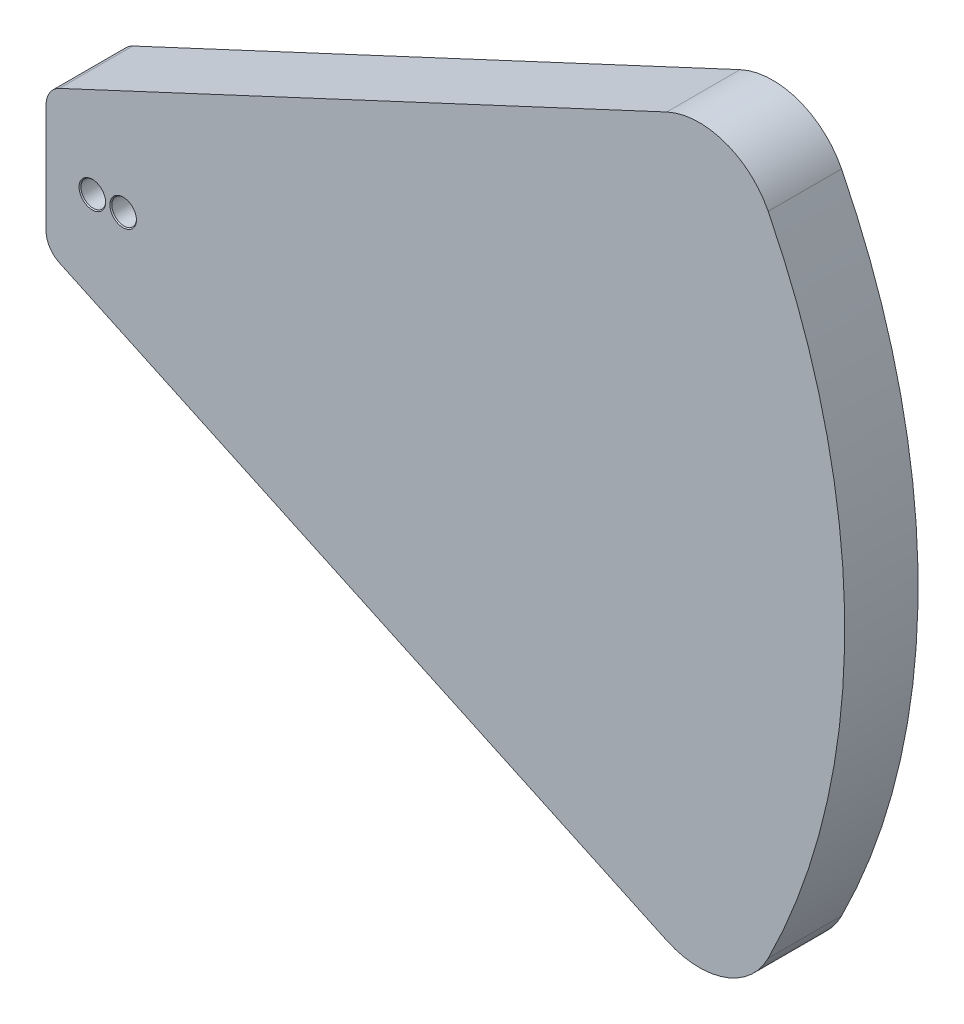
ISO-10303-21;
HEADER;
FILE_DESCRIPTION(('STEP AP214'),'2;1');
FILE_NAME('part.step','',(''),(''),'','','');
FILE_SCHEMA(('AUTOMOTIVE_DESIGN { 1 0 10303 214 1 1 1 1 }'));
ENDSEC;
DATA;
#1=APPLICATION_CONTEXT('core data for automotive mechanical design processes');
#2=APPLICATION_PROTOCOL_DEFINITION('international standard','automotive_design',2000,#1);
#3=PRODUCT_CONTEXT('',#1,'mechanical');
#4=PRODUCT('Part','Part','',(#3));
#5=PRODUCT_RELATED_PRODUCT_CATEGORY('part','',(#4));
#6=PRODUCT_DEFINITION_FORMATION('','',#4);
#7=PRODUCT_DEFINITION_CONTEXT('part definition',#1,'design');
#8=PRODUCT_DEFINITION('design','',#6,#7);
#9=PRODUCT_DEFINITION_SHAPE('','',#8);
#10=(LENGTH_UNIT() NAMED_UNIT(*) SI_UNIT(.MILLI.,.METRE.));
#11=(NAMED_UNIT(*) PLANE_ANGLE_UNIT() SI_UNIT($,.RADIAN.));
#12=(NAMED_UNIT(*) SI_UNIT($,.STERADIAN.) SOLID_ANGLE_UNIT());
#13=UNCERTAINTY_MEASURE_WITH_UNIT(LENGTH_MEASURE(1.E-05),#10,'distance_accuracy_value','');
#14=(GEOMETRIC_REPRESENTATION_CONTEXT(3) GLOBAL_UNCERTAINTY_ASSIGNED_CONTEXT((#13)) GLOBAL_UNIT_ASSIGNED_CONTEXT((#10,
#11,#12)) REPRESENTATION_CONTEXT('',''));
#15=CARTESIAN_POINT('',(0.,0.,0.));
#16=DIRECTION('',(0.,0.,1.));
#17=DIRECTION('',(1.,0.,0.));
#18=AXIS2_PLACEMENT_3D('',#15,#16,#17);
#19=CARTESIAN_POINT('',(0.,0.,0.));
#20=DIRECTION('',(0.,0.,1.));
#21=DIRECTION('',(1.,0.,0.));
#22=AXIS2_PLACEMENT_3D('',#19,#20,#21);
#23=PLANE('',#22);
#24=DIRECTION('',(-0.906307787036649,-0.4226182617407,0.));
#25=VECTOR('',#24,1.);
#26=CARTESIAN_POINT('',(-10.,9.,0.));
#27=LINE('',#26,#25);
#28=CARTESIAN_POINT('',(70.5513726645762,46.5617219483892,0.));
#29=VERTEX_POINT('',#28);
#30=CARTESIAN_POINT('',(-8.2678547852221,9.80771257868747,0.));
#31=VERTEX_POINT('',#30);
#32=EDGE_CURVE('E198',#29,#31,#27,.T.);
#33=ORIENTED_EDGE('',*,*,#32,.F.);
#34=CARTESIAN_POINT('',(74.7775552819833,37.4986440780227,0.));
#35=DIRECTION('',(0.,0.,1.));
#36=DIRECTION('',(1.,0.,0.));
#37=AXIS2_PLACEMENT_3D('',#34,#35,#36);
#38=CIRCLE('',#37,10.);
#39=CARTESIAN_POINT('',(83.7165675864627,41.9812838159857,0.));
#40=VERTEX_POINT('',#39);
#41=EDGE_CURVE('E253',#29,#40,#38,.F.);
#42=ORIENTED_EDGE('',*,*,#41,.T.);
#43=CARTESIAN_POINT('',(0.,0.,0.));
#44=DIRECTION('',(0.,0.,1.));
#45=DIRECTION('',(1.,0.,0.));
#46=AXIS2_PLACEMENT_3D('',#43,#44,#45);
#47=CIRCLE('',#46,93.6530398828416);
#48=CARTESIAN_POINT('',(83.7165675864627,-41.9812838159857,0.));
#49=VERTEX_POINT('',#48);
#50=EDGE_CURVE('E192',#49,#40,#47,.T.);
#51=ORIENTED_EDGE('',*,*,#50,.F.);
#52=CARTESIAN_POINT('',(74.7775552819833,-37.4986440780227,0.));
#53=DIRECTION('',(0.,0.,1.));
#54=DIRECTION('',(1.,0.,0.));
#55=AXIS2_PLACEMENT_3D('',#52,#53,#54);
#56=CIRCLE('',#55,10.);
#57=CARTESIAN_POINT('',(70.5513726645762,-46.5617219483892,0.));
#58=VERTEX_POINT('',#57);
#59=EDGE_CURVE('E247',#49,#58,#56,.F.);
#60=ORIENTED_EDGE('',*,*,#59,.T.);
#61=DIRECTION('',(0.906307787036649,-0.4226182617407,0.));
#62=VECTOR('',#61,1.);
#63=CARTESIAN_POINT('',(-10.,-9.,0.));
#64=LINE('',#63,#62);
#65=CARTESIAN_POINT('',(-8.2678547852221,-9.80771257868747,0.));
#66=VERTEX_POINT('',#65);
#67=EDGE_CURVE('E179',#66,#58,#64,.T.);
#68=ORIENTED_EDGE('',*,*,#67,.F.);
#69=CARTESIAN_POINT('',(-7.,-7.08878921757752,0.));
#70=DIRECTION('',(0.,0.,1.));
#71=DIRECTION('',(1.,0.,0.));
#72=AXIS2_PLACEMENT_3D('',#69,#70,#71);
#73=CIRCLE('',#72,3.);
#74=CARTESIAN_POINT('',(-10.,-7.08878921757752,0.));
#75=VERTEX_POINT('',#74);
#76=EDGE_CURVE('E233',#66,#75,#73,.F.);
#77=ORIENTED_EDGE('',*,*,#76,.T.);
#78=DIRECTION('',(0.,-1.,0.));
#79=VECTOR('',#78,1.);
#80=CARTESIAN_POINT('',(-10.,-9.,0.));
#81=LINE('',#80,#79);
#82=CARTESIAN_POINT('',(-10.,-5.5,0.));
#83=VERTEX_POINT('',#82);
#84=EDGE_CURVE('E196',#83,#75,#81,.T.);
#85=ORIENTED_EDGE('',*,*,#84,.F.);
#86=CARTESIAN_POINT('',(-9.,-5.5,0.));
#87=DIRECTION('',(0.,0.,1.));
#88=DIRECTION('',(1.,0.,0.));
#89=AXIS2_PLACEMENT_3D('',#86,#87,#88);
#90=CIRCLE('',#89,1.);
#91=CARTESIAN_POINT('',(-9.,-4.5,0.));
#92=VERTEX_POINT('',#91);
#93=EDGE_CURVE('E216',#83,#92,#90,.F.);
#94=ORIENTED_EDGE('',*,*,#93,.T.);
#95=DIRECTION('',(-1.,0.,0.));
#96=VECTOR('',#95,1.);
#97=CARTESIAN_POINT('',(0.,-4.5,0.));
#98=LINE('',#97,#96);
#99=CARTESIAN_POINT('',(0.,-4.5,0.));
#100=VERTEX_POINT('',#99);
#101=EDGE_CURVE('E153',#100,#92,#98,.T.);
#102=ORIENTED_EDGE('',*,*,#101,.F.);
#103=CARTESIAN_POINT('',(0.,0.,0.));
#104=DIRECTION('',(0.,0.,-1.));
#105=DIRECTION('',(-1.,0.,0.));
#106=AXIS2_PLACEMENT_3D('',#103,#104,#105);
#107=CIRCLE('',#106,4.5);
#108=CARTESIAN_POINT('',(0.,4.5,0.));
#109=VERTEX_POINT('',#108);
#110=EDGE_CURVE('E174',#109,#100,#107,.T.);
#111=ORIENTED_EDGE('',*,*,#110,.F.);
#112=DIRECTION('',(1.,0.,0.));
#113=VECTOR('',#112,1.);
#114=CARTESIAN_POINT('',(-10.,4.5,0.));
#115=LINE('',#114,#113);
#116=CARTESIAN_POINT('',(-9.,4.5,0.));
#117=VERTEX_POINT('',#116);
#118=EDGE_CURVE('E157',#117,#109,#115,.T.);
#119=ORIENTED_EDGE('',*,*,#118,.F.);
#120=CARTESIAN_POINT('',(-9.,5.5,0.));
#121=DIRECTION('',(0.,0.,1.));
#122=DIRECTION('',(1.,0.,0.));
#123=AXIS2_PLACEMENT_3D('',#120,#121,#122);
#124=CIRCLE('',#123,1.);
#125=CARTESIAN_POINT('',(-10.,5.5,0.));
#126=VERTEX_POINT('',#125);
#127=EDGE_CURVE('E213',#117,#126,#124,.F.);
#128=ORIENTED_EDGE('',*,*,#127,.T.);
#129=CARTESIAN_POINT('',(-10.,7.08878921757752,0.));
#130=VERTEX_POINT('',#129);
#131=EDGE_CURVE('E183',#130,#126,#81,.T.);
#132=ORIENTED_EDGE('',*,*,#131,.F.);
#133=CARTESIAN_POINT('',(-7.,7.08878921757752,0.));
#134=DIRECTION('',(0.,0.,1.));
#135=DIRECTION('',(1.,0.,0.));
#136=AXIS2_PLACEMENT_3D('',#133,#134,#135);
#137=CIRCLE('',#136,3.);
#138=EDGE_CURVE('E231',#130,#31,#137,.F.);
#139=ORIENTED_EDGE('',*,*,#138,.T.);
#140=EDGE_LOOP('',(#33,#42,#51,#60,#68,#77,#85,#94,#102,#111,#119,#128,#132,#139));
#141=FACE_BOUND('',#140,.T.);
#142=ADVANCED_FACE('F39',(#141),#23,.F.);
#143=CARTESIAN_POINT('',(-10.,-9.,9.525));
#144=DIRECTION('',(0.4226182617407,0.90630778703665,0.));
#145=DIRECTION('',(-0.906307787036649,0.4226182617407,0.));
#146=AXIS2_PLACEMENT_3D('',#143,#144,#145);
#147=PLANE('',#146);
#148=ORIENTED_EDGE('',*,*,#67,.T.);
#149=DIRECTION('',(0.,0.,-1.));
#150=VECTOR('',#149,1.);
#151=CARTESIAN_POINT('',(70.5513726645763,-46.5617219483892,9.525));
#152=LINE('',#151,#150);
#153=CARTESIAN_POINT('',(70.5513726645762,-46.5617219483892,9.525));
#154=VERTEX_POINT('',#153);
#155=EDGE_CURVE('E11',#58,#154,#152,.F.);
#156=ORIENTED_EDGE('',*,*,#155,.T.);
#157=DIRECTION('',(0.906307787036649,-0.4226182617407,0.));
#158=VECTOR('',#157,1.);
#159=CARTESIAN_POINT('',(-10.,-9.,9.525));
#160=LINE('',#159,#158);
#161=CARTESIAN_POINT('',(-8.2678547852221,-9.80771257868747,9.525));
#162=VERTEX_POINT('',#161);
#163=EDGE_CURVE('E185',#162,#154,#160,.T.);
#164=ORIENTED_EDGE('',*,*,#163,.F.);
#165=DIRECTION('',(0.,0.,-1.));
#166=VECTOR('',#165,1.);
#167=CARTESIAN_POINT('',(-8.2678547852221,-9.80771257868747,9.525));
#168=LINE('',#167,#166);
#169=EDGE_CURVE('E241',#162,#66,#168,.T.);
#170=ORIENTED_EDGE('',*,*,#169,.T.);
#171=EDGE_LOOP('',(#148,#156,#164,#170));
#172=FACE_BOUND('',#171,.T.);
#173=ADVANCED_FACE('F280',(#172),#147,.F.);
#174=CARTESIAN_POINT('',(0.,0.,9.525));
#175=DIRECTION('',(0.,0.,-1.));
#176=DIRECTION('',(-1.,0.,0.));
#177=AXIS2_PLACEMENT_3D('',#174,#175,#176);
#178=CYLINDRICAL_SURFACE('',#177,93.6530398828416);
#179=ORIENTED_EDGE('',*,*,#50,.T.);
#180=DIRECTION('',(0.,0.,-1.));
#181=VECTOR('',#180,1.);
#182=CARTESIAN_POINT('',(83.7165675864627,41.9812838159857,9.525));
#183=LINE('',#182,#181);
#184=CARTESIAN_POINT('',(83.7165675864627,41.9812838159857,9.525));
#185=VERTEX_POINT('',#184);
#186=EDGE_CURVE('E58',#40,#185,#183,.F.);
#187=ORIENTED_EDGE('',*,*,#186,.T.);
#188=CARTESIAN_POINT('',(0.,0.,9.525));
#189=DIRECTION('',(0.,0.,1.));
#190=DIRECTION('',(1.,0.,0.));
#191=AXIS2_PLACEMENT_3D('',#188,#189,#190);
#192=CIRCLE('',#191,93.6530398828416);
#193=CARTESIAN_POINT('',(83.7165675864627,-41.9812838159857,9.525));
#194=VERTEX_POINT('',#193);
#195=EDGE_CURVE('E184',#194,#185,#192,.T.);
#196=ORIENTED_EDGE('',*,*,#195,.F.);
#197=DIRECTION('',(0.,0.,-1.));
#198=VECTOR('',#197,1.);
#199=CARTESIAN_POINT('',(83.7165675864627,-41.9812838159857,9.525));
#200=LINE('',#199,#198);
#201=EDGE_CURVE('E251',#194,#49,#200,.T.);
#202=ORIENTED_EDGE('',*,*,#201,.T.);
#203=EDGE_LOOP('',(#179,#187,#196,#202));
#204=FACE_BOUND('',#203,.T.);
#205=ADVANCED_FACE('F275',(#204),#178,.T.);
#206=CARTESIAN_POINT('',(-10.,9.,9.525));
#207=DIRECTION('',(0.4226182617407,-0.90630778703665,0.));
#208=DIRECTION('',(0.906307787036649,0.4226182617407,0.));
#209=AXIS2_PLACEMENT_3D('',#206,#207,#208);
#210=PLANE('',#209);
#211=DIRECTION('',(-0.906307787036649,-0.4226182617407,0.));
#212=VECTOR('',#211,1.);
#213=CARTESIAN_POINT('',(-10.,9.,9.525));
#214=LINE('',#213,#212);
#215=CARTESIAN_POINT('',(70.5513726645762,46.5617219483892,9.525));
#216=VERTEX_POINT('',#215);
#217=CARTESIAN_POINT('',(-8.2678547852221,9.80771257868747,9.525));
#218=VERTEX_POINT('',#217);
#219=EDGE_CURVE('E190',#216,#218,#214,.T.);
#220=ORIENTED_EDGE('',*,*,#219,.F.);
#221=DIRECTION('',(0.,0.,-1.));
#222=VECTOR('',#221,1.);
#223=CARTESIAN_POINT('',(70.5513726645763,46.5617219483892,9.525));
#224=LINE('',#223,#222);
#225=EDGE_CURVE('E248',#216,#29,#224,.T.);
#226=ORIENTED_EDGE('',*,*,#225,.T.);
#227=ORIENTED_EDGE('',*,*,#32,.T.);
#228=DIRECTION('',(0.,0.,-1.));
#229=VECTOR('',#228,1.);
#230=CARTESIAN_POINT('',(-8.2678547852221,9.80771257868747,9.525));
#231=LINE('',#230,#229);
#232=EDGE_CURVE('E237',#31,#218,#231,.F.);
#233=ORIENTED_EDGE('',*,*,#232,.T.);
#234=EDGE_LOOP('',(#220,#226,#227,#233));
#235=FACE_BOUND('',#234,.T.);
#236=ADVANCED_FACE('F264',(#235),#210,.F.);
#237=CARTESIAN_POINT('',(-10.,-9.,9.525));
#238=DIRECTION('',(1.,0.,0.));
#239=DIRECTION('',(0.,0.,-1.));
#240=AXIS2_PLACEMENT_3D('',#237,#238,#239);
#241=PLANE('',#240);
#242=DIRECTION('',(0.,-1.,0.));
#243=VECTOR('',#242,1.);
#244=CARTESIAN_POINT('',(-10.,-9.,9.525));
#245=LINE('',#244,#243);
#246=CARTESIAN_POINT('',(-10.,7.08878921757752,9.525));
#247=VERTEX_POINT('',#246);
#248=CARTESIAN_POINT('',(-10.,-7.08878921757752,9.525));
#249=VERTEX_POINT('',#248);
#250=EDGE_CURVE('E187',#247,#249,#245,.T.);
#251=ORIENTED_EDGE('',*,*,#250,.F.);
#252=DIRECTION('',(0.,0.,-1.));
#253=VECTOR('',#252,1.);
#254=CARTESIAN_POINT('',(-10.,7.08878921757752,9.525));
#255=LINE('',#254,#253);
#256=EDGE_CURVE('E226',#247,#130,#255,.T.);
#257=ORIENTED_EDGE('',*,*,#256,.T.);
#258=ORIENTED_EDGE('',*,*,#131,.T.);
#259=DIRECTION('',(0.,0.,-1.));
#260=VECTOR('',#259,1.);
#261=CARTESIAN_POINT('',(-10.,5.5,9.525));
#262=LINE('',#261,#260);
#263=CARTESIAN_POINT('',(-10.,5.5,4.));
#264=VERTEX_POINT('',#263);
#265=EDGE_CURVE('E195',#126,#264,#262,.F.);
#266=ORIENTED_EDGE('',*,*,#265,.T.);
#267=DIRECTION('',(0.,1.,0.));
#268=VECTOR('',#267,1.);
#269=CARTESIAN_POINT('',(-10.,4.5,4.));
#270=LINE('',#269,#268);
#271=CARTESIAN_POINT('',(-10.,-5.5,4.));
#272=VERTEX_POINT('',#271);
#273=EDGE_CURVE('E163',#272,#264,#270,.T.);
#274=ORIENTED_EDGE('',*,*,#273,.F.);
#275=DIRECTION('',(0.,0.,-1.));
#276=VECTOR('',#275,1.);
#277=CARTESIAN_POINT('',(-10.,-5.5,9.525));
#278=LINE('',#277,#276);
#279=EDGE_CURVE('E209',#272,#83,#278,.T.);
#280=ORIENTED_EDGE('',*,*,#279,.T.);
#281=ORIENTED_EDGE('',*,*,#84,.T.);
#282=DIRECTION('',(0.,0.,-1.));
#283=VECTOR('',#282,1.);
#284=CARTESIAN_POINT('',(-10.,-7.08878921757752,9.525));
#285=LINE('',#284,#283);
#286=EDGE_CURVE('E228',#75,#249,#285,.F.);
#287=ORIENTED_EDGE('',*,*,#286,.T.);
#288=EDGE_LOOP('',(#251,#257,#258,#266,#274,#280,#281,#287));
#289=FACE_BOUND('',#288,.T.);
#290=ADVANCED_FACE('F290',(#289),#241,.F.);
#291=CARTESIAN_POINT('',(0.,0.,9.525));
#292=DIRECTION('',(0.,0.,1.));
#293=DIRECTION('',(1.,0.,0.));
#294=AXIS2_PLACEMENT_3D('',#291,#292,#293);
#295=PLANE('',#294);
#296=CARTESIAN_POINT('',(0.,0.,9.525));
#297=DIRECTION('',(0.,0.,1.));
#298=DIRECTION('',(1.,0.,0.));
#299=AXIS2_PLACEMENT_3D('',#296,#297,#298);
#300=CIRCLE('',#299,1.725);
#301=CARTESIAN_POINT('',(1.725,0.,9.525));
#302=VERTEX_POINT('',#301);
#303=EDGE_CURVE('E370',#302,#302,#300,.T.);
#304=ORIENTED_EDGE('',*,*,#303,.F.);
#305=EDGE_LOOP('',(#304));
#306=FACE_BOUND('',#305,.T.);
#307=CARTESIAN_POINT('',(-4.,0.,9.525));
#308=DIRECTION('',(0.,0.,1.));
#309=DIRECTION('',(1.,0.,0.));
#310=AXIS2_PLACEMENT_3D('',#307,#308,#309);
#311=CIRCLE('',#310,1.725);
#312=CARTESIAN_POINT('',(-2.275,0.,9.525));
#313=VERTEX_POINT('',#312);
#314=EDGE_CURVE('E206',#313,#313,#311,.T.);
#315=ORIENTED_EDGE('',*,*,#314,.F.);
#316=EDGE_LOOP('',(#315));
#317=FACE_BOUND('',#316,.T.);
#318=ORIENTED_EDGE('',*,*,#195,.T.);
#319=CARTESIAN_POINT('',(74.7775552819833,37.4986440780227,9.525));
#320=DIRECTION('',(0.,0.,1.));
#321=DIRECTION('',(1.,0.,0.));
#322=AXIS2_PLACEMENT_3D('',#319,#320,#321);
#323=CIRCLE('',#322,10.);
#324=EDGE_CURVE('E50',#185,#216,#323,.T.);
#325=ORIENTED_EDGE('',*,*,#324,.T.);
#326=ORIENTED_EDGE('',*,*,#219,.T.);
#327=CARTESIAN_POINT('',(-7.,7.08878921757752,9.525));
#328=DIRECTION('',(0.,0.,1.));
#329=DIRECTION('',(1.,0.,0.));
#330=AXIS2_PLACEMENT_3D('',#327,#328,#329);
#331=CIRCLE('',#330,3.);
#332=EDGE_CURVE('E243',#218,#247,#331,.T.);
#333=ORIENTED_EDGE('',*,*,#332,.T.);
#334=ORIENTED_EDGE('',*,*,#250,.T.);
#335=CARTESIAN_POINT('',(-7.,-7.08878921757752,9.525));
#336=DIRECTION('',(0.,0.,1.));
#337=DIRECTION('',(1.,0.,0.));
#338=AXIS2_PLACEMENT_3D('',#335,#336,#337);
#339=CIRCLE('',#338,3.);
#340=EDGE_CURVE('E239',#249,#162,#339,.T.);
#341=ORIENTED_EDGE('',*,*,#340,.T.);
#342=ORIENTED_EDGE('',*,*,#163,.T.);
#343=CARTESIAN_POINT('',(74.7775552819833,-37.4986440780227,9.525));
#344=DIRECTION('',(0.,0.,1.));
#345=DIRECTION('',(1.,0.,0.));
#346=AXIS2_PLACEMENT_3D('',#343,#344,#345);
#347=CIRCLE('',#346,10.);
#348=EDGE_CURVE('E260',#154,#194,#347,.T.);
#349=ORIENTED_EDGE('',*,*,#348,.T.);
#350=EDGE_LOOP('',(#318,#325,#326,#333,#334,#341,#342,#349));
#351=FACE_BOUND('',#350,.T.);
#352=ADVANCED_FACE('F261',(#306,#317,#351),#295,.T.);
#353=CARTESIAN_POINT('',(-10.,4.5,4.));
#354=DIRECTION('',(0.,1.,0.));
#355=DIRECTION('',(0.,0.,1.));
#356=AXIS2_PLACEMENT_3D('',#353,#354,#355);
#357=PLANE('',#356);
#358=DIRECTION('',(1.,0.,0.));
#359=VECTOR('',#358,1.);
#360=CARTESIAN_POINT('',(-10.,4.5,4.));
#361=LINE('',#360,#359);
#362=CARTESIAN_POINT('',(-9.,4.5,4.));
#363=VERTEX_POINT('',#362);
#364=CARTESIAN_POINT('',(0.,4.5,4.));
#365=VERTEX_POINT('',#364);
#366=EDGE_CURVE('E142',#363,#365,#361,.T.);
#367=ORIENTED_EDGE('',*,*,#366,.F.);
#368=DIRECTION('',(0.,0.,-1.));
#369=VECTOR('',#368,1.);
#370=CARTESIAN_POINT('',(-9.,4.5,4.));
#371=LINE('',#370,#369);
#372=EDGE_CURVE('E219',#363,#117,#371,.T.);
#373=ORIENTED_EDGE('',*,*,#372,.T.);
#374=ORIENTED_EDGE('',*,*,#118,.T.);
#375=DIRECTION('',(0.,0.,-1.));
#376=VECTOR('',#375,1.);
#377=CARTESIAN_POINT('',(0.,4.5,4.));
#378=LINE('',#377,#376);
#379=EDGE_CURVE('E156',#365,#109,#378,.T.);
#380=ORIENTED_EDGE('',*,*,#379,.F.);
#381=EDGE_LOOP('',(#367,#373,#374,#380));
#382=FACE_BOUND('',#381,.T.);
#383=ADVANCED_FACE('F160',(#382),#357,.F.);
#384=CARTESIAN_POINT('',(0.,-4.5,4.));
#385=DIRECTION('',(0.,-1.,0.));
#386=DIRECTION('',(0.,0.,-1.));
#387=AXIS2_PLACEMENT_3D('',#384,#385,#386);
#388=PLANE('',#387);
#389=ORIENTED_EDGE('',*,*,#101,.T.);
#390=DIRECTION('',(0.,0.,-1.));
#391=VECTOR('',#390,1.);
#392=CARTESIAN_POINT('',(-9.,-4.5,4.));
#393=LINE('',#392,#391);
#394=CARTESIAN_POINT('',(-9.,-4.5,4.));
#395=VERTEX_POINT('',#394);
#396=EDGE_CURVE('E217',#92,#395,#393,.F.);
#397=ORIENTED_EDGE('',*,*,#396,.T.);
#398=DIRECTION('',(-1.,0.,0.));
#399=VECTOR('',#398,1.);
#400=CARTESIAN_POINT('',(0.,-4.5,4.));
#401=LINE('',#400,#399);
#402=CARTESIAN_POINT('',(0.,-4.5,4.));
#403=VERTEX_POINT('',#402);
#404=EDGE_CURVE('E169',#403,#395,#401,.T.);
#405=ORIENTED_EDGE('',*,*,#404,.F.);
#406=DIRECTION('',(0.,0.,-1.));
#407=VECTOR('',#406,1.);
#408=CARTESIAN_POINT('',(0.,-4.5,4.));
#409=LINE('',#408,#407);
#410=EDGE_CURVE('E162',#403,#100,#409,.T.);
#411=ORIENTED_EDGE('',*,*,#410,.T.);
#412=EDGE_LOOP('',(#389,#397,#405,#411));
#413=FACE_BOUND('',#412,.T.);
#414=ADVANCED_FACE('F293',(#413),#388,.F.);
#415=CARTESIAN_POINT('',(0.,0.,4.));
#416=DIRECTION('',(0.,0.,-1.));
#417=DIRECTION('',(-1.,0.,0.));
#418=AXIS2_PLACEMENT_3D('',#415,#416,#417);
#419=CYLINDRICAL_SURFACE('',#418,4.5);
#420=ORIENTED_EDGE('',*,*,#110,.T.);
#421=ORIENTED_EDGE('',*,*,#410,.F.);
#422=CARTESIAN_POINT('',(0.,0.,4.));
#423=DIRECTION('',(0.,0.,-1.));
#424=DIRECTION('',(-1.,0.,0.));
#425=AXIS2_PLACEMENT_3D('',#422,#423,#424);
#426=CIRCLE('',#425,4.5);
#427=EDGE_CURVE('E150',#365,#403,#426,.T.);
#428=ORIENTED_EDGE('',*,*,#427,.F.);
#429=ORIENTED_EDGE('',*,*,#379,.T.);
#430=EDGE_LOOP('',(#420,#421,#428,#429));
#431=FACE_BOUND('',#430,.T.);
#432=ADVANCED_FACE('F167',(#431),#419,.F.);
#433=CARTESIAN_POINT('',(0.,0.,4.));
#434=DIRECTION('',(0.,0.,-1.));
#435=DIRECTION('',(-1.,0.,0.));
#436=AXIS2_PLACEMENT_3D('',#433,#434,#435);
#437=PLANE('',#436);
#438=CARTESIAN_POINT('',(0.,0.,4.));
#439=DIRECTION('',(0.,0.,-1.));
#440=DIRECTION('',(-1.,0.,0.));
#441=AXIS2_PLACEMENT_3D('',#438,#439,#440);
#442=CIRCLE('',#441,1.6);
#443=CARTESIAN_POINT('',(-1.6,0.,4.));
#444=VERTEX_POINT('',#443);
#445=EDGE_CURVE('E201',#444,#444,#442,.T.);
#446=ORIENTED_EDGE('',*,*,#445,.F.);
#447=EDGE_LOOP('',(#446));
#448=FACE_BOUND('',#447,.T.);
#449=CARTESIAN_POINT('',(-4.,0.,4.));
#450=DIRECTION('',(0.,0.,-1.));
#451=DIRECTION('',(-1.,0.,0.));
#452=AXIS2_PLACEMENT_3D('',#449,#450,#451);
#453=CIRCLE('',#452,1.6);
#454=CARTESIAN_POINT('',(-5.6,0.,4.));
#455=VERTEX_POINT('',#454);
#456=EDGE_CURVE('E178',#455,#455,#453,.T.);
#457=ORIENTED_EDGE('',*,*,#456,.F.);
#458=EDGE_LOOP('',(#457));
#459=FACE_BOUND('',#458,.T.);
#460=ORIENTED_EDGE('',*,*,#273,.T.);
#461=CARTESIAN_POINT('',(-9.,5.5,4.));
#462=DIRECTION('',(0.,0.,-1.));
#463=DIRECTION('',(-1.,0.,0.));
#464=AXIS2_PLACEMENT_3D('',#461,#462,#463);
#465=CIRCLE('',#464,1.);
#466=EDGE_CURVE('E149',#264,#363,#465,.F.);
#467=ORIENTED_EDGE('',*,*,#466,.T.);
#468=ORIENTED_EDGE('',*,*,#366,.T.);
#469=ORIENTED_EDGE('',*,*,#427,.T.);
#470=ORIENTED_EDGE('',*,*,#404,.T.);
#471=CARTESIAN_POINT('',(-9.,-5.5,4.));
#472=DIRECTION('',(0.,0.,-1.));
#473=DIRECTION('',(-1.,0.,0.));
#474=AXIS2_PLACEMENT_3D('',#471,#472,#473);
#475=CIRCLE('',#474,1.);
#476=EDGE_CURVE('E225',#395,#272,#475,.F.);
#477=ORIENTED_EDGE('',*,*,#476,.T.);
#478=EDGE_LOOP('',(#460,#467,#468,#469,#470,#477));
#479=FACE_BOUND('',#478,.T.);
#480=ADVANCED_FACE('F145',(#448,#459,#479),#437,.T.);
#481=CARTESIAN_POINT('',(-4.,0.,9.525));
#482=DIRECTION('',(0.,0.,1.));
#483=DIRECTION('',(1.,0.,0.));
#484=AXIS2_PLACEMENT_3D('',#481,#482,#483);
#485=CYLINDRICAL_SURFACE('',#484,1.6);
#486=ORIENTED_EDGE('',*,*,#456,.T.);
#487=EDGE_LOOP('',(#486));
#488=FACE_BOUND('',#487,.T.);
#489=CARTESIAN_POINT('',(-4.,0.,9.4));
#490=DIRECTION('',(0.,0.,1.));
#491=DIRECTION('',(1.,0.,0.));
#492=AXIS2_PLACEMENT_3D('',#489,#490,#491);
#493=CIRCLE('',#492,1.6);
#494=CARTESIAN_POINT('',(-2.4,0.,9.4));
#495=VERTEX_POINT('',#494);
#496=EDGE_CURVE('E205',#495,#495,#493,.T.);
#497=ORIENTED_EDGE('',*,*,#496,.T.);
#498=EDGE_LOOP('',(#497));
#499=FACE_BOUND('',#498,.T.);
#500=ADVANCED_FACE('F350',(#488,#499),#485,.F.);
#501=CARTESIAN_POINT('',(-4.,0.,9.525));
#502=DIRECTION('',(0.,0.,1.));
#503=DIRECTION('',(1.,0.,0.));
#504=AXIS2_PLACEMENT_3D('',#501,#502,#503);
#505=CONICAL_SURFACE('',#504,1.725,0.785398163397452);
#506=ORIENTED_EDGE('',*,*,#496,.F.);
#507=EDGE_LOOP('',(#506));
#508=FACE_BOUND('',#507,.T.);
#509=ORIENTED_EDGE('',*,*,#314,.T.);
#510=EDGE_LOOP('',(#509));
#511=FACE_BOUND('',#510,.T.);
#512=ADVANCED_FACE('F337',(#508,#511),#505,.F.);
#513=CARTESIAN_POINT('',(0.,0.,9.525));
#514=DIRECTION('',(0.,0.,1.));
#515=DIRECTION('',(1.,0.,0.));
#516=AXIS2_PLACEMENT_3D('',#513,#514,#515);
#517=CYLINDRICAL_SURFACE('',#516,1.6);
#518=ORIENTED_EDGE('',*,*,#445,.T.);
#519=EDGE_LOOP('',(#518));
#520=FACE_BOUND('',#519,.T.);
#521=CARTESIAN_POINT('',(0.,0.,9.4));
#522=DIRECTION('',(0.,0.,1.));
#523=DIRECTION('',(1.,0.,0.));
#524=AXIS2_PLACEMENT_3D('',#521,#522,#523);
#525=CIRCLE('',#524,1.6);
#526=CARTESIAN_POINT('',(1.6,0.,9.4));
#527=VERTEX_POINT('',#526);
#528=EDGE_CURVE('E210',#527,#527,#525,.T.);
#529=ORIENTED_EDGE('',*,*,#528,.T.);
#530=EDGE_LOOP('',(#529));
#531=FACE_BOUND('',#530,.T.);
#532=ADVANCED_FACE('F335',(#520,#531),#517,.F.);
#533=CARTESIAN_POINT('',(0.,0.,9.525));
#534=DIRECTION('',(0.,0.,1.));
#535=DIRECTION('',(1.,0.,0.));
#536=AXIS2_PLACEMENT_3D('',#533,#534,#535);
#537=CONICAL_SURFACE('',#536,1.725,0.785398163397453);
#538=ORIENTED_EDGE('',*,*,#528,.F.);
#539=EDGE_LOOP('',(#538));
#540=FACE_BOUND('',#539,.T.);
#541=ORIENTED_EDGE('',*,*,#303,.T.);
#542=EDGE_LOOP('',(#541));
#543=FACE_BOUND('',#542,.T.);
#544=ADVANCED_FACE('F330',(#540,#543),#537,.F.);
#545=CARTESIAN_POINT('',(-9.,-5.5,9.525));
#546=DIRECTION('',(0.,0.,-1.));
#547=DIRECTION('',(-1.,0.,0.));
#548=AXIS2_PLACEMENT_3D('',#545,#546,#547);
#549=CYLINDRICAL_SURFACE('',#548,1.);
#550=ORIENTED_EDGE('',*,*,#476,.F.);
#551=ORIENTED_EDGE('',*,*,#396,.F.);
#552=ORIENTED_EDGE('',*,*,#93,.F.);
#553=ORIENTED_EDGE('',*,*,#279,.F.);
#554=EDGE_LOOP('',(#550,#551,#552,#553));
#555=FACE_BOUND('',#554,.T.);
#556=ADVANCED_FACE('F292',(#555),#549,.T.);
#557=CARTESIAN_POINT('',(-9.,5.5,4.));
#558=DIRECTION('',(0.,0.,-1.));
#559=DIRECTION('',(-1.,0.,0.));
#560=AXIS2_PLACEMENT_3D('',#557,#558,#559);
#561=CYLINDRICAL_SURFACE('',#560,1.);
#562=ORIENTED_EDGE('',*,*,#466,.F.);
#563=ORIENTED_EDGE('',*,*,#265,.F.);
#564=ORIENTED_EDGE('',*,*,#127,.F.);
#565=ORIENTED_EDGE('',*,*,#372,.F.);
#566=EDGE_LOOP('',(#562,#563,#564,#565));
#567=FACE_BOUND('',#566,.T.);
#568=ADVANCED_FACE('F297',(#567),#561,.T.);
#569=CARTESIAN_POINT('',(-7.,7.08878921757752,9.525));
#570=DIRECTION('',(0.,0.,-1.));
#571=DIRECTION('',(-1.,0.,0.));
#572=AXIS2_PLACEMENT_3D('',#569,#570,#571);
#573=CYLINDRICAL_SURFACE('',#572,3.);
#574=ORIENTED_EDGE('',*,*,#332,.F.);
#575=ORIENTED_EDGE('',*,*,#232,.F.);
#576=ORIENTED_EDGE('',*,*,#138,.F.);
#577=ORIENTED_EDGE('',*,*,#256,.F.);
#578=EDGE_LOOP('',(#574,#575,#576,#577));
#579=FACE_BOUND('',#578,.T.);
#580=ADVANCED_FACE('F305',(#579),#573,.T.);
#581=CARTESIAN_POINT('',(-7.,-7.08878921757752,9.525));
#582=DIRECTION('',(0.,0.,-1.));
#583=DIRECTION('',(-1.,0.,0.));
#584=AXIS2_PLACEMENT_3D('',#581,#582,#583);
#585=CYLINDRICAL_SURFACE('',#584,3.);
#586=ORIENTED_EDGE('',*,*,#340,.F.);
#587=ORIENTED_EDGE('',*,*,#286,.F.);
#588=ORIENTED_EDGE('',*,*,#76,.F.);
#589=ORIENTED_EDGE('',*,*,#169,.F.);
#590=EDGE_LOOP('',(#586,#587,#588,#589));
#591=FACE_BOUND('',#590,.T.);
#592=ADVANCED_FACE('F283',(#591),#585,.T.);
#593=CARTESIAN_POINT('',(74.7775552819833,37.4986440780227,9.525));
#594=DIRECTION('',(0.,0.,-1.));
#595=DIRECTION('',(-1.,0.,0.));
#596=AXIS2_PLACEMENT_3D('',#593,#594,#595);
#597=CYLINDRICAL_SURFACE('',#596,10.);
#598=ORIENTED_EDGE('',*,*,#324,.F.);
#599=ORIENTED_EDGE('',*,*,#186,.F.);
#600=ORIENTED_EDGE('',*,*,#41,.F.);
#601=ORIENTED_EDGE('',*,*,#225,.F.);
#602=EDGE_LOOP('',(#598,#599,#600,#601));
#603=FACE_BOUND('',#602,.T.);
#604=ADVANCED_FACE('F267',(#603),#597,.T.);
#605=CARTESIAN_POINT('',(74.7775552819833,-37.4986440780227,9.525));
#606=DIRECTION('',(0.,0.,-1.));
#607=DIRECTION('',(-1.,0.,0.));
#608=AXIS2_PLACEMENT_3D('',#605,#606,#607);
#609=CYLINDRICAL_SURFACE('',#608,10.);
#610=ORIENTED_EDGE('',*,*,#348,.F.);
#611=ORIENTED_EDGE('',*,*,#155,.F.);
#612=ORIENTED_EDGE('',*,*,#59,.F.);
#613=ORIENTED_EDGE('',*,*,#201,.F.);
#614=EDGE_LOOP('',(#610,#611,#612,#613));
#615=FACE_BOUND('',#614,.T.);
#616=ADVANCED_FACE('F41',(#615),#609,.T.);
#617=CLOSED_SHELL('',(#142,#173,#205,#236,#290,#352,#383,#414,#432,#480,#500,#512,#532,#544,
#556,#568,#580,#592,#604,#616));
#618=MANIFOLD_SOLID_BREP('B2',#617);
#619=ADVANCED_BREP_SHAPE_REPRESENTATION('',(#18,#618),#14);
#620=SHAPE_DEFINITION_REPRESENTATION(#9,#619);
ENDSEC;
END-ISO-10303-21;
